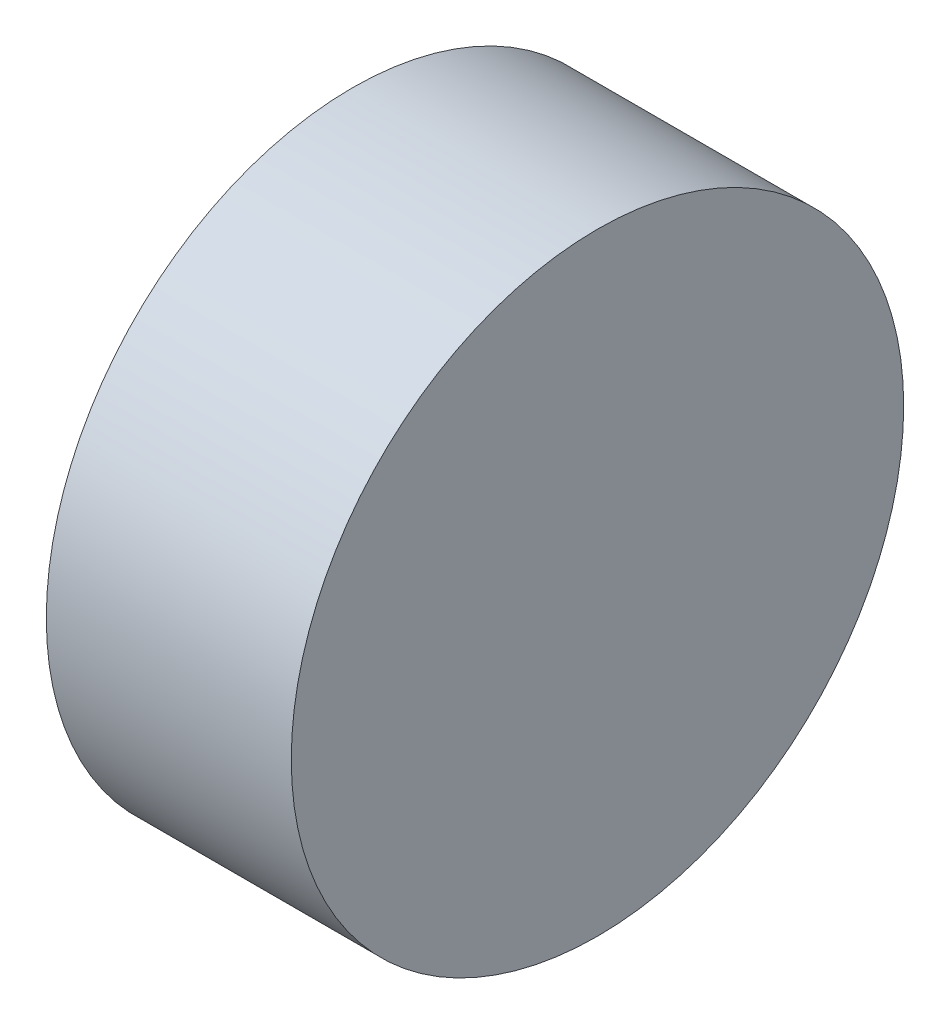
ISO-10303-21;
HEADER;
FILE_DESCRIPTION(('STEP AP214'),'2;1');
FILE_NAME('part.step','',(''),(''),'','','');
FILE_SCHEMA(('AUTOMOTIVE_DESIGN { 1 0 10303 214 1 1 1 1 }'));
ENDSEC;
DATA;
#1=APPLICATION_CONTEXT('core data for automotive mechanical design processes');
#2=APPLICATION_PROTOCOL_DEFINITION('international standard','automotive_design',2000,#1);
#3=PRODUCT_CONTEXT('',#1,'mechanical');
#4=PRODUCT('Part','Part','',(#3));
#5=PRODUCT_RELATED_PRODUCT_CATEGORY('part','',(#4));
#6=PRODUCT_DEFINITION_FORMATION('','',#4);
#7=PRODUCT_DEFINITION_CONTEXT('part definition',#1,'design');
#8=PRODUCT_DEFINITION('design','',#6,#7);
#9=PRODUCT_DEFINITION_SHAPE('','',#8);
#10=(LENGTH_UNIT() NAMED_UNIT(*) SI_UNIT(.MILLI.,.METRE.));
#11=(NAMED_UNIT(*) PLANE_ANGLE_UNIT() SI_UNIT($,.RADIAN.));
#12=(NAMED_UNIT(*) SI_UNIT($,.STERADIAN.) SOLID_ANGLE_UNIT());
#13=UNCERTAINTY_MEASURE_WITH_UNIT(LENGTH_MEASURE(1.E-05),#10,'distance_accuracy_value','');
#14=(GEOMETRIC_REPRESENTATION_CONTEXT(3) GLOBAL_UNCERTAINTY_ASSIGNED_CONTEXT((#13)) GLOBAL_UNIT_ASSIGNED_CONTEXT((#10,
#11,#12)) REPRESENTATION_CONTEXT('',''));
#15=CARTESIAN_POINT('',(0.,0.,0.));
#16=DIRECTION('',(0.,0.,1.));
#17=DIRECTION('',(1.,0.,0.));
#18=AXIS2_PLACEMENT_3D('',#15,#16,#17);
#19=CARTESIAN_POINT('',(70.,0.,0.));
#20=DIRECTION('',(-1.,0.,0.));
#21=DIRECTION('',(0.,0.,1.));
#22=AXIS2_PLACEMENT_3D('',#19,#20,#21);
#23=CYLINDRICAL_SURFACE('',#22,5.);
#24=CARTESIAN_POINT('',(40.,0.,0.));
#25=DIRECTION('',(1.,0.,0.));
#26=DIRECTION('',(0.,0.,-1.));
#27=AXIS2_PLACEMENT_3D('',#24,#25,#26);
#28=CIRCLE('',#27,5.);
#29=CARTESIAN_POINT('',(40.,0.,-5.00000000000001));
#30=VERTEX_POINT('',#29);
#31=EDGE_CURVE('E36',#30,#30,#28,.T.);
#32=ORIENTED_EDGE('',*,*,#31,.T.);
#33=EDGE_LOOP('',(#32));
#34=FACE_BOUND('',#33,.T.);
#35=CARTESIAN_POINT('',(44.,0.,0.));
#36=DIRECTION('',(1.,0.,0.));
#37=DIRECTION('',(0.,0.,-1.));
#38=AXIS2_PLACEMENT_3D('',#35,#36,#37);
#39=CIRCLE('',#38,5.);
#40=CARTESIAN_POINT('',(44.,0.,-5.00000000000001));
#41=VERTEX_POINT('',#40);
#42=EDGE_CURVE('E10',#41,#41,#39,.T.);
#43=ORIENTED_EDGE('',*,*,#42,.F.);
#44=EDGE_LOOP('',(#43));
#45=FACE_BOUND('',#44,.T.);
#46=ADVANCED_FACE('F30',(#34,#45),#23,.T.);
#47=CARTESIAN_POINT('',(40.,0.,0.));
#48=DIRECTION('',(1.,0.,0.));
#49=DIRECTION('',(0.,0.,-1.));
#50=AXIS2_PLACEMENT_3D('',#47,#48,#49);
#51=PLANE('',#50);
#52=ORIENTED_EDGE('',*,*,#31,.F.);
#53=EDGE_LOOP('',(#52));
#54=FACE_BOUND('',#53,.T.);
#55=ADVANCED_FACE('F55',(#54),#51,.F.);
#56=CARTESIAN_POINT('',(44.,0.,0.));
#57=DIRECTION('',(1.,0.,0.));
#58=DIRECTION('',(0.,0.,-1.));
#59=AXIS2_PLACEMENT_3D('',#56,#57,#58);
#60=CYLINDRICAL_SURFACE('',#59,32.5);
#61=CARTESIAN_POINT('',(44.,0.,0.));
#62=DIRECTION('',(1.,0.,0.));
#63=DIRECTION('',(0.,0.,-1.));
#64=AXIS2_PLACEMENT_3D('',#61,#62,#63);
#65=CIRCLE('',#64,32.5);
#66=CARTESIAN_POINT('',(44.,0.,-32.5));
#67=VERTEX_POINT('',#66);
#68=EDGE_CURVE('E40',#67,#67,#65,.T.);
#69=ORIENTED_EDGE('',*,*,#68,.T.);
#70=EDGE_LOOP('',(#69));
#71=FACE_BOUND('',#70,.T.);
#72=CARTESIAN_POINT('',(70.,0.,0.));
#73=DIRECTION('',(1.,0.,0.));
#74=DIRECTION('',(0.,0.,-1.));
#75=AXIS2_PLACEMENT_3D('',#72,#73,#74);
#76=CIRCLE('',#75,32.5);
#77=CARTESIAN_POINT('',(70.,0.,-32.5));
#78=VERTEX_POINT('',#77);
#79=EDGE_CURVE('E44',#78,#78,#76,.T.);
#80=ORIENTED_EDGE('',*,*,#79,.F.);
#81=EDGE_LOOP('',(#80));
#82=FACE_BOUND('',#81,.T.);
#83=ADVANCED_FACE('F52',(#71,#82),#60,.T.);
#84=CARTESIAN_POINT('',(44.,0.,0.));
#85=DIRECTION('',(1.,0.,0.));
#86=DIRECTION('',(0.,0.,-1.));
#87=AXIS2_PLACEMENT_3D('',#84,#85,#86);
#88=PLANE('',#87);
#89=ORIENTED_EDGE('',*,*,#42,.T.);
#90=EDGE_LOOP('',(#89));
#91=FACE_BOUND('',#90,.T.);
#92=ORIENTED_EDGE('',*,*,#68,.F.);
#93=EDGE_LOOP('',(#92));
#94=FACE_BOUND('',#93,.T.);
#95=ADVANCED_FACE('F54',(#91,#94),#88,.F.);
#96=CARTESIAN_POINT('',(70.,0.,0.));
#97=DIRECTION('',(1.,0.,0.));
#98=DIRECTION('',(0.,0.,-1.));
#99=AXIS2_PLACEMENT_3D('',#96,#97,#98);
#100=PLANE('',#99);
#101=ORIENTED_EDGE('',*,*,#79,.T.);
#102=EDGE_LOOP('',(#101));
#103=FACE_BOUND('',#102,.T.);
#104=ADVANCED_FACE('F50',(#103),#100,.T.);
#105=CLOSED_SHELL('',(#46,#55,#83,#95,#104));
#106=MANIFOLD_SOLID_BREP('B2',#105);
#107=ADVANCED_BREP_SHAPE_REPRESENTATION('',(#18,#106),#14);
#108=SHAPE_DEFINITION_REPRESENTATION(#9,#107);
ENDSEC;
END-ISO-10303-21;
